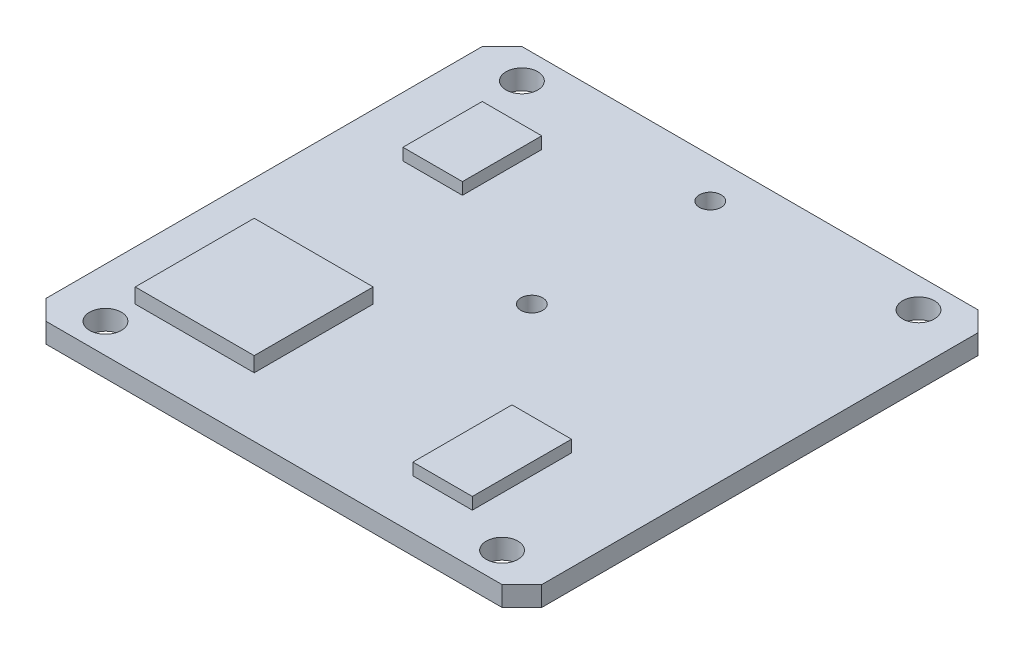
ISO-10303-21;
HEADER;
FILE_DESCRIPTION(('STEP AP214'),'2;1');
FILE_NAME('part.step','',(''),(''),'','','');
FILE_SCHEMA(('AUTOMOTIVE_DESIGN { 1 0 10303 214 1 1 1 1 }'));
ENDSEC;
DATA;
#1=APPLICATION_CONTEXT('core data for automotive mechanical design processes');
#2=APPLICATION_PROTOCOL_DEFINITION('international standard','automotive_design',2000,#1);
#3=PRODUCT_CONTEXT('',#1,'mechanical');
#4=PRODUCT('Part','Part','',(#3));
#5=PRODUCT_RELATED_PRODUCT_CATEGORY('part','',(#4));
#6=PRODUCT_DEFINITION_FORMATION('','',#4);
#7=PRODUCT_DEFINITION_CONTEXT('part definition',#1,'design');
#8=PRODUCT_DEFINITION('design','',#6,#7);
#9=PRODUCT_DEFINITION_SHAPE('','',#8);
#10=(LENGTH_UNIT() NAMED_UNIT(*) SI_UNIT(.MILLI.,.METRE.));
#11=(NAMED_UNIT(*) PLANE_ANGLE_UNIT() SI_UNIT($,.RADIAN.));
#12=(NAMED_UNIT(*) SI_UNIT($,.STERADIAN.) SOLID_ANGLE_UNIT());
#13=UNCERTAINTY_MEASURE_WITH_UNIT(LENGTH_MEASURE(1.E-05),#10,'distance_accuracy_value','');
#14=(GEOMETRIC_REPRESENTATION_CONTEXT(3) GLOBAL_UNCERTAINTY_ASSIGNED_CONTEXT((#13)) GLOBAL_UNIT_ASSIGNED_CONTEXT((#10,
#11,#12)) REPRESENTATION_CONTEXT('',''));
#15=CARTESIAN_POINT('',(0.,0.,0.));
#16=DIRECTION('',(0.,0.,1.));
#17=DIRECTION('',(1.,0.,0.));
#18=AXIS2_PLACEMENT_3D('',#15,#16,#17);
#19=CARTESIAN_POINT('',(0.,1.,0.));
#20=DIRECTION('',(0.,1.,0.));
#21=DIRECTION('',(0.,0.,1.));
#22=AXIS2_PLACEMENT_3D('',#19,#20,#21);
#23=PLANE('',#22);
#24=CARTESIAN_POINT('',(20.,1.,-21.));
#25=DIRECTION('',(0.,1.,0.));
#26=DIRECTION('',(0.,0.,-1.));
#27=AXIS2_PLACEMENT_3D('',#24,#25,#26);
#28=CIRCLE('',#27,1.6);
#29=CARTESIAN_POINT('',(20.,1.,-22.6));
#30=VERTEX_POINT('',#29);
#31=EDGE_CURVE('E271',#30,#30,#28,.T.);
#32=ORIENTED_EDGE('',*,*,#31,.F.);
#33=EDGE_LOOP('',(#32));
#34=FACE_BOUND('',#33,.T.);
#35=CARTESIAN_POINT('',(20.,1.,21.));
#36=DIRECTION('',(0.,1.,0.));
#37=DIRECTION('',(0.,0.,1.));
#38=AXIS2_PLACEMENT_3D('',#35,#36,#37);
#39=CIRCLE('',#38,1.6);
#40=CARTESIAN_POINT('',(20.,1.,22.6));
#41=VERTEX_POINT('',#40);
#42=EDGE_CURVE('E277',#41,#41,#39,.T.);
#43=ORIENTED_EDGE('',*,*,#42,.F.);
#44=EDGE_LOOP('',(#43));
#45=FACE_BOUND('',#44,.T.);
#46=CARTESIAN_POINT('',(-20.,1.,21.));
#47=DIRECTION('',(0.,1.,0.));
#48=DIRECTION('',(0.,0.,-1.));
#49=AXIS2_PLACEMENT_3D('',#46,#47,#48);
#50=CIRCLE('',#49,1.6);
#51=CARTESIAN_POINT('',(-20.,1.,19.4));
#52=VERTEX_POINT('',#51);
#53=EDGE_CURVE('E283',#52,#52,#50,.T.);
#54=ORIENTED_EDGE('',*,*,#53,.F.);
#55=EDGE_LOOP('',(#54));
#56=FACE_BOUND('',#55,.T.);
#57=CARTESIAN_POINT('',(0.,1.,-20.));
#58=DIRECTION('',(0.,1.,0.));
#59=DIRECTION('',(0.,0.,1.));
#60=AXIS2_PLACEMENT_3D('',#57,#58,#59);
#61=CIRCLE('',#60,1.1);
#62=CARTESIAN_POINT('',(0.,1.,-18.9));
#63=VERTEX_POINT('',#62);
#64=EDGE_CURVE('E264',#63,#63,#61,.T.);
#65=ORIENTED_EDGE('',*,*,#64,.F.);
#66=EDGE_LOOP('',(#65));
#67=FACE_BOUND('',#66,.T.);
#68=CARTESIAN_POINT('',(0.,1.,-2.));
#69=DIRECTION('',(0.,1.,0.));
#70=DIRECTION('',(0.,0.,1.));
#71=AXIS2_PLACEMENT_3D('',#68,#69,#70);
#72=CIRCLE('',#71,1.1);
#73=CARTESIAN_POINT('',(0.,1.,-0.899999999999998));
#74=VERTEX_POINT('',#73);
#75=EDGE_CURVE('E260',#74,#74,#72,.T.);
#76=ORIENTED_EDGE('',*,*,#75,.F.);
#77=EDGE_LOOP('',(#76));
#78=FACE_BOUND('',#77,.T.);
#79=CARTESIAN_POINT('',(-20.,1.,-21.));
#80=DIRECTION('',(0.,1.,0.));
#81=DIRECTION('',(0.,0.,1.));
#82=AXIS2_PLACEMENT_3D('',#79,#80,#81);
#83=CIRCLE('',#82,1.6);
#84=CARTESIAN_POINT('',(-20.,1.,-19.4));
#85=VERTEX_POINT('',#84);
#86=EDGE_CURVE('E270',#85,#85,#83,.T.);
#87=ORIENTED_EDGE('',*,*,#86,.F.);
#88=EDGE_LOOP('',(#87));
#89=FACE_BOUND('',#88,.T.);
#90=DIRECTION('',(-1.,0.,0.));
#91=VECTOR('',#90,1.);
#92=CARTESIAN_POINT('',(-25.,1.,-24.));
#93=LINE('',#92,#91);
#94=CARTESIAN_POINT('',(23.,1.,-24.));
#95=VERTEX_POINT('',#94);
#96=CARTESIAN_POINT('',(-23.,1.,-24.));
#97=VERTEX_POINT('',#96);
#98=EDGE_CURVE('E307',#95,#97,#93,.T.);
#99=ORIENTED_EDGE('',*,*,#98,.T.);
#100=DIRECTION('',(0.707106781186548,0.,-0.707106781186548));
#101=VECTOR('',#100,1.);
#102=CARTESIAN_POINT('',(-23.5,1.,-23.5));
#103=LINE('',#102,#101);
#104=CARTESIAN_POINT('',(-25.,1.,-22.));
#105=VERTEX_POINT('',#104);
#106=EDGE_CURVE('E344',#97,#105,#103,.F.);
#107=ORIENTED_EDGE('',*,*,#106,.T.);
#108=DIRECTION('',(0.,0.,1.));
#109=VECTOR('',#108,1.);
#110=CARTESIAN_POINT('',(-25.,1.,-24.));
#111=LINE('',#110,#109);
#112=CARTESIAN_POINT('',(-25.,1.,22.));
#113=VERTEX_POINT('',#112);
#114=EDGE_CURVE('E297',#105,#113,#111,.T.);
#115=ORIENTED_EDGE('',*,*,#114,.T.);
#116=DIRECTION('',(-0.707106781186548,0.,-0.707106781186548));
#117=VECTOR('',#116,1.);
#118=CARTESIAN_POINT('',(-23.5,1.,23.5));
#119=LINE('',#118,#117);
#120=CARTESIAN_POINT('',(-23.,1.,24.));
#121=VERTEX_POINT('',#120);
#122=EDGE_CURVE('E342',#113,#121,#119,.F.);
#123=ORIENTED_EDGE('',*,*,#122,.T.);
#124=DIRECTION('',(1.,0.,0.));
#125=VECTOR('',#124,1.);
#126=CARTESIAN_POINT('',(-25.,1.,24.));
#127=LINE('',#126,#125);
#128=CARTESIAN_POINT('',(23.,1.,24.));
#129=VERTEX_POINT('',#128);
#130=EDGE_CURVE('E300',#121,#129,#127,.T.);
#131=ORIENTED_EDGE('',*,*,#130,.T.);
#132=DIRECTION('',(-0.707106781186548,0.,0.707106781186547));
#133=VECTOR('',#132,1.);
#134=CARTESIAN_POINT('',(23.5,1.,23.5));
#135=LINE('',#134,#133);
#136=CARTESIAN_POINT('',(25.,1.,22.));
#137=VERTEX_POINT('',#136);
#138=EDGE_CURVE('E338',#129,#137,#135,.F.);
#139=ORIENTED_EDGE('',*,*,#138,.T.);
#140=DIRECTION('',(0.,0.,-1.));
#141=VECTOR('',#140,1.);
#142=CARTESIAN_POINT('',(25.,1.,-24.));
#143=LINE('',#142,#141);
#144=CARTESIAN_POINT('',(25.,1.,-22.));
#145=VERTEX_POINT('',#144);
#146=EDGE_CURVE('E304',#137,#145,#143,.T.);
#147=ORIENTED_EDGE('',*,*,#146,.T.);
#148=DIRECTION('',(0.707106781186546,0.,0.707106781186549));
#149=VECTOR('',#148,1.);
#150=CARTESIAN_POINT('',(23.5,1.,-23.5));
#151=LINE('',#150,#149);
#152=EDGE_CURVE('E340',#145,#95,#151,.F.);
#153=ORIENTED_EDGE('',*,*,#152,.T.);
#154=EDGE_LOOP('',(#99,#107,#115,#123,#131,#139,#147,#153));
#155=FACE_BOUND('',#154,.T.);
#156=DIRECTION('',(1.,0.,0.));
#157=VECTOR('',#156,1.);
#158=CARTESIAN_POINT('',(-8.,1.,18.));
#159=LINE('',#158,#157);
#160=CARTESIAN_POINT('',(-20.,1.,18.));
#161=VERTEX_POINT('',#160);
#162=CARTESIAN_POINT('',(-8.,1.,18.));
#163=VERTEX_POINT('',#162);
#164=EDGE_CURVE('E245',#161,#163,#159,.T.);
#165=ORIENTED_EDGE('',*,*,#164,.F.);
#166=DIRECTION('',(0.,0.,1.));
#167=VECTOR('',#166,1.);
#168=CARTESIAN_POINT('',(-20.,1.,6.));
#169=LINE('',#168,#167);
#170=CARTESIAN_POINT('',(-20.,1.,6.));
#171=VERTEX_POINT('',#170);
#172=EDGE_CURVE('E231',#171,#161,#169,.T.);
#173=ORIENTED_EDGE('',*,*,#172,.F.);
#174=DIRECTION('',(-1.,0.,0.));
#175=VECTOR('',#174,1.);
#176=CARTESIAN_POINT('',(-8.,1.,6.));
#177=LINE('',#176,#175);
#178=CARTESIAN_POINT('',(-8.,1.,6.));
#179=VERTEX_POINT('',#178);
#180=EDGE_CURVE('E236',#179,#171,#177,.T.);
#181=ORIENTED_EDGE('',*,*,#180,.F.);
#182=DIRECTION('',(0.,0.,-1.));
#183=VECTOR('',#182,1.);
#184=CARTESIAN_POINT('',(-8.,1.,6.));
#185=LINE('',#184,#183);
#186=EDGE_CURVE('E247',#163,#179,#185,.T.);
#187=ORIENTED_EDGE('',*,*,#186,.F.);
#188=EDGE_LOOP('',(#165,#173,#181,#187));
#189=FACE_BOUND('',#188,.T.);
#190=DIRECTION('',(-1.,0.,0.));
#191=VECTOR('',#190,1.);
#192=CARTESIAN_POINT('',(-13.,1.,-16.));
#193=LINE('',#192,#191);
#194=CARTESIAN_POINT('',(-13.,1.,-16.));
#195=VERTEX_POINT('',#194);
#196=CARTESIAN_POINT('',(-19.,1.,-16.));
#197=VERTEX_POINT('',#196);
#198=EDGE_CURVE('E203',#195,#197,#193,.T.);
#199=ORIENTED_EDGE('',*,*,#198,.F.);
#200=DIRECTION('',(0.,0.,-1.));
#201=VECTOR('',#200,1.);
#202=CARTESIAN_POINT('',(-13.,1.,-16.));
#203=LINE('',#202,#201);
#204=CARTESIAN_POINT('',(-13.,1.,-8.));
#205=VERTEX_POINT('',#204);
#206=EDGE_CURVE('E200',#205,#195,#203,.T.);
#207=ORIENTED_EDGE('',*,*,#206,.F.);
#208=DIRECTION('',(1.,0.,0.));
#209=VECTOR('',#208,1.);
#210=CARTESIAN_POINT('',(-13.,1.,-8.));
#211=LINE('',#210,#209);
#212=CARTESIAN_POINT('',(-19.,1.,-8.));
#213=VERTEX_POINT('',#212);
#214=EDGE_CURVE('E212',#213,#205,#211,.T.);
#215=ORIENTED_EDGE('',*,*,#214,.F.);
#216=DIRECTION('',(0.,0.,1.));
#217=VECTOR('',#216,1.);
#218=CARTESIAN_POINT('',(-19.,1.,-16.));
#219=LINE('',#218,#217);
#220=EDGE_CURVE('E220',#197,#213,#219,.T.);
#221=ORIENTED_EDGE('',*,*,#220,.F.);
#222=EDGE_LOOP('',(#199,#207,#215,#221));
#223=FACE_BOUND('',#222,.T.);
#224=DIRECTION('',(-1.,0.,0.));
#225=VECTOR('',#224,1.);
#226=CARTESIAN_POINT('',(15.,1.,9.));
#227=LINE('',#226,#225);
#228=CARTESIAN_POINT('',(15.,1.,9.));
#229=VERTEX_POINT('',#228);
#230=CARTESIAN_POINT('',(9.,1.,9.));
#231=VERTEX_POINT('',#230);
#232=EDGE_CURVE('E664',#229,#231,#227,.T.);
#233=ORIENTED_EDGE('',*,*,#232,.F.);
#234=DIRECTION('',(0.,0.,-1.));
#235=VECTOR('',#234,1.);
#236=CARTESIAN_POINT('',(15.,1.,9.));
#237=LINE('',#236,#235);
#238=CARTESIAN_POINT('',(15.,1.,19.));
#239=VERTEX_POINT('',#238);
#240=EDGE_CURVE('E198',#239,#229,#237,.T.);
#241=ORIENTED_EDGE('',*,*,#240,.F.);
#242=DIRECTION('',(1.,0.,0.));
#243=VECTOR('',#242,1.);
#244=CARTESIAN_POINT('',(15.,1.,19.));
#245=LINE('',#244,#243);
#246=CARTESIAN_POINT('',(9.,1.,19.));
#247=VERTEX_POINT('',#246);
#248=EDGE_CURVE('E194',#247,#239,#245,.T.);
#249=ORIENTED_EDGE('',*,*,#248,.F.);
#250=DIRECTION('',(0.,0.,1.));
#251=VECTOR('',#250,1.);
#252=CARTESIAN_POINT('',(9.,1.,9.));
#253=LINE('',#252,#251);
#254=EDGE_CURVE('E661',#231,#247,#253,.T.);
#255=ORIENTED_EDGE('',*,*,#254,.F.);
#256=EDGE_LOOP('',(#233,#241,#249,#255));
#257=FACE_BOUND('',#256,.T.);
#258=ADVANCED_FACE('F37',(#34,#45,#56,#67,#78,#89,#155,#189,#223,#257),#23,.T.);
#259=CARTESIAN_POINT('',(-25.,1.,-24.));
#260=DIRECTION('',(1.,0.,0.));
#261=DIRECTION('',(0.,0.,-1.));
#262=AXIS2_PLACEMENT_3D('',#259,#260,#261);
#263=PLANE('',#262);
#264=ORIENTED_EDGE('',*,*,#114,.F.);
#265=DIRECTION('',(0.,-1.,0.));
#266=VECTOR('',#265,1.);
#267=CARTESIAN_POINT('',(-25.,1.,-22.));
#268=LINE('',#267,#266);
#269=CARTESIAN_POINT('',(-25.,-1.,-22.));
#270=VERTEX_POINT('',#269);
#271=EDGE_CURVE('E322',#105,#270,#268,.T.);
#272=ORIENTED_EDGE('',*,*,#271,.T.);
#273=DIRECTION('',(0.,0.,1.));
#274=VECTOR('',#273,1.);
#275=CARTESIAN_POINT('',(-25.,-1.,-24.));
#276=LINE('',#275,#274);
#277=CARTESIAN_POINT('',(-25.,-1.,22.));
#278=VERTEX_POINT('',#277);
#279=EDGE_CURVE('E294',#270,#278,#276,.T.);
#280=ORIENTED_EDGE('',*,*,#279,.T.);
#281=DIRECTION('',(0.,1.,0.));
#282=VECTOR('',#281,1.);
#283=CARTESIAN_POINT('',(-25.,1.,22.));
#284=LINE('',#283,#282);
#285=EDGE_CURVE('E310',#278,#113,#284,.T.);
#286=ORIENTED_EDGE('',*,*,#285,.T.);
#287=EDGE_LOOP('',(#264,#272,#280,#286));
#288=FACE_BOUND('',#287,.T.);
#289=ADVANCED_FACE('F380',(#288),#263,.F.);
#290=CARTESIAN_POINT('',(-25.,1.,24.));
#291=DIRECTION('',(0.,0.,-1.));
#292=DIRECTION('',(-1.,0.,0.));
#293=AXIS2_PLACEMENT_3D('',#290,#291,#292);
#294=PLANE('',#293);
#295=ORIENTED_EDGE('',*,*,#130,.F.);
#296=DIRECTION('',(0.,-1.,0.));
#297=VECTOR('',#296,1.);
#298=CARTESIAN_POINT('',(-23.,1.,24.));
#299=LINE('',#298,#297);
#300=CARTESIAN_POINT('',(-23.,-1.,24.));
#301=VERTEX_POINT('',#300);
#302=EDGE_CURVE('E348',#121,#301,#299,.T.);
#303=ORIENTED_EDGE('',*,*,#302,.T.);
#304=DIRECTION('',(1.,0.,0.));
#305=VECTOR('',#304,1.);
#306=CARTESIAN_POINT('',(-25.,-1.,24.));
#307=LINE('',#306,#305);
#308=CARTESIAN_POINT('',(23.,-1.,24.));
#309=VERTEX_POINT('',#308);
#310=EDGE_CURVE('E313',#301,#309,#307,.T.);
#311=ORIENTED_EDGE('',*,*,#310,.T.);
#312=DIRECTION('',(0.,1.,0.));
#313=VECTOR('',#312,1.);
#314=CARTESIAN_POINT('',(23.,1.,24.));
#315=LINE('',#314,#313);
#316=EDGE_CURVE('E346',#309,#129,#315,.T.);
#317=ORIENTED_EDGE('',*,*,#316,.T.);
#318=EDGE_LOOP('',(#295,#303,#311,#317));
#319=FACE_BOUND('',#318,.T.);
#320=ADVANCED_FACE('F388',(#319),#294,.F.);
#321=CARTESIAN_POINT('',(25.,1.,-24.));
#322=DIRECTION('',(-1.,0.,0.));
#323=DIRECTION('',(0.,0.,1.));
#324=AXIS2_PLACEMENT_3D('',#321,#322,#323);
#325=PLANE('',#324);
#326=DIRECTION('',(0.,0.,-1.));
#327=VECTOR('',#326,1.);
#328=CARTESIAN_POINT('',(25.,-1.,-24.));
#329=LINE('',#328,#327);
#330=CARTESIAN_POINT('',(25.,-1.,22.));
#331=VERTEX_POINT('',#330);
#332=CARTESIAN_POINT('',(25.,-1.,-22.));
#333=VERTEX_POINT('',#332);
#334=EDGE_CURVE('E316',#331,#333,#329,.T.);
#335=ORIENTED_EDGE('',*,*,#334,.T.);
#336=DIRECTION('',(0.,1.,0.));
#337=VECTOR('',#336,1.);
#338=CARTESIAN_POINT('',(25.,1.,-22.));
#339=LINE('',#338,#337);
#340=EDGE_CURVE('E11',#333,#145,#339,.T.);
#341=ORIENTED_EDGE('',*,*,#340,.T.);
#342=ORIENTED_EDGE('',*,*,#146,.F.);
#343=DIRECTION('',(0.,-1.,0.));
#344=VECTOR('',#343,1.);
#345=CARTESIAN_POINT('',(25.,1.,22.));
#346=LINE('',#345,#344);
#347=EDGE_CURVE('E46',#137,#331,#346,.T.);
#348=ORIENTED_EDGE('',*,*,#347,.T.);
#349=EDGE_LOOP('',(#335,#341,#342,#348));
#350=FACE_BOUND('',#349,.T.);
#351=ADVANCED_FACE('F355',(#350),#325,.F.);
#352=CARTESIAN_POINT('',(-25.,1.,-24.));
#353=DIRECTION('',(0.,0.,1.));
#354=DIRECTION('',(1.,0.,0.));
#355=AXIS2_PLACEMENT_3D('',#352,#353,#354);
#356=PLANE('',#355);
#357=DIRECTION('',(-1.,0.,0.));
#358=VECTOR('',#357,1.);
#359=CARTESIAN_POINT('',(-25.,-1.,-24.));
#360=LINE('',#359,#358);
#361=CARTESIAN_POINT('',(23.,-1.,-24.));
#362=VERTEX_POINT('',#361);
#363=CARTESIAN_POINT('',(-23.,-1.,-24.));
#364=VERTEX_POINT('',#363);
#365=EDGE_CURVE('E301',#362,#364,#360,.T.);
#366=ORIENTED_EDGE('',*,*,#365,.T.);
#367=DIRECTION('',(0.,1.,0.));
#368=VECTOR('',#367,1.);
#369=CARTESIAN_POINT('',(-23.,1.,-24.));
#370=LINE('',#369,#368);
#371=EDGE_CURVE('E336',#364,#97,#370,.T.);
#372=ORIENTED_EDGE('',*,*,#371,.T.);
#373=ORIENTED_EDGE('',*,*,#98,.F.);
#374=DIRECTION('',(0.,-1.,0.));
#375=VECTOR('',#374,1.);
#376=CARTESIAN_POINT('',(23.,1.,-24.));
#377=LINE('',#376,#375);
#378=EDGE_CURVE('E333',#95,#362,#377,.T.);
#379=ORIENTED_EDGE('',*,*,#378,.T.);
#380=EDGE_LOOP('',(#366,#372,#373,#379));
#381=FACE_BOUND('',#380,.T.);
#382=ADVANCED_FACE('F370',(#381),#356,.F.);
#383=CARTESIAN_POINT('',(0.,-1.,0.));
#384=DIRECTION('',(0.,1.,0.));
#385=DIRECTION('',(0.,0.,1.));
#386=AXIS2_PLACEMENT_3D('',#383,#384,#385);
#387=PLANE('',#386);
#388=CARTESIAN_POINT('',(20.,-1.,-21.));
#389=DIRECTION('',(0.,1.,0.));
#390=DIRECTION('',(0.,0.,-1.));
#391=AXIS2_PLACEMENT_3D('',#388,#389,#390);
#392=CIRCLE('',#391,1.6);
#393=CARTESIAN_POINT('',(20.,-1.,-22.6));
#394=VERTEX_POINT('',#393);
#395=EDGE_CURVE('E267',#394,#394,#392,.T.);
#396=ORIENTED_EDGE('',*,*,#395,.T.);
#397=EDGE_LOOP('',(#396));
#398=FACE_BOUND('',#397,.T.);
#399=CARTESIAN_POINT('',(20.,-1.,21.));
#400=DIRECTION('',(0.,1.,0.));
#401=DIRECTION('',(0.,0.,1.));
#402=AXIS2_PLACEMENT_3D('',#399,#400,#401);
#403=CIRCLE('',#402,1.6);
#404=CARTESIAN_POINT('',(20.,-1.,22.6));
#405=VERTEX_POINT('',#404);
#406=EDGE_CURVE('E274',#405,#405,#403,.T.);
#407=ORIENTED_EDGE('',*,*,#406,.T.);
#408=EDGE_LOOP('',(#407));
#409=FACE_BOUND('',#408,.T.);
#410=CARTESIAN_POINT('',(-20.,-1.,21.));
#411=DIRECTION('',(0.,1.,0.));
#412=DIRECTION('',(0.,0.,-1.));
#413=AXIS2_PLACEMENT_3D('',#410,#411,#412);
#414=CIRCLE('',#413,1.6);
#415=CARTESIAN_POINT('',(-20.,-1.,19.4));
#416=VERTEX_POINT('',#415);
#417=EDGE_CURVE('E280',#416,#416,#414,.T.);
#418=ORIENTED_EDGE('',*,*,#417,.T.);
#419=EDGE_LOOP('',(#418));
#420=FACE_BOUND('',#419,.T.);
#421=CARTESIAN_POINT('',(0.,-1.,-20.));
#422=DIRECTION('',(0.,1.,0.));
#423=DIRECTION('',(0.,0.,1.));
#424=AXIS2_PLACEMENT_3D('',#421,#422,#423);
#425=CIRCLE('',#424,1.1);
#426=CARTESIAN_POINT('',(0.,-1.,-18.9));
#427=VERTEX_POINT('',#426);
#428=EDGE_CURVE('E286',#427,#427,#425,.T.);
#429=ORIENTED_EDGE('',*,*,#428,.T.);
#430=EDGE_LOOP('',(#429));
#431=FACE_BOUND('',#430,.T.);
#432=CARTESIAN_POINT('',(0.,-1.,-2.));
#433=DIRECTION('',(0.,1.,0.));
#434=DIRECTION('',(0.,0.,1.));
#435=AXIS2_PLACEMENT_3D('',#432,#433,#434);
#436=CIRCLE('',#435,1.1);
#437=CARTESIAN_POINT('',(0.,-1.,-0.899999999999998));
#438=VERTEX_POINT('',#437);
#439=EDGE_CURVE('E261',#438,#438,#436,.T.);
#440=ORIENTED_EDGE('',*,*,#439,.T.);
#441=EDGE_LOOP('',(#440));
#442=FACE_BOUND('',#441,.T.);
#443=CARTESIAN_POINT('',(-20.,-1.,-21.));
#444=DIRECTION('',(0.,1.,0.));
#445=DIRECTION('',(0.,0.,1.));
#446=AXIS2_PLACEMENT_3D('',#443,#444,#445);
#447=CIRCLE('',#446,1.6);
#448=CARTESIAN_POINT('',(-20.,-1.,-19.4));
#449=VERTEX_POINT('',#448);
#450=EDGE_CURVE('E291',#449,#449,#447,.T.);
#451=ORIENTED_EDGE('',*,*,#450,.T.);
#452=EDGE_LOOP('',(#451));
#453=FACE_BOUND('',#452,.T.);
#454=ORIENTED_EDGE('',*,*,#279,.F.);
#455=DIRECTION('',(-0.707106781186548,0.,0.707106781186548));
#456=VECTOR('',#455,1.);
#457=CARTESIAN_POINT('',(-25.,-1.,-22.));
#458=LINE('',#457,#456);
#459=EDGE_CURVE('E331',#270,#364,#458,.F.);
#460=ORIENTED_EDGE('',*,*,#459,.T.);
#461=ORIENTED_EDGE('',*,*,#365,.F.);
#462=DIRECTION('',(-0.707106781186546,0.,-0.707106781186549));
#463=VECTOR('',#462,1.);
#464=CARTESIAN_POINT('',(23.,-1.,-24.));
#465=LINE('',#464,#463);
#466=EDGE_CURVE('E327',#362,#333,#465,.F.);
#467=ORIENTED_EDGE('',*,*,#466,.T.);
#468=ORIENTED_EDGE('',*,*,#334,.F.);
#469=DIRECTION('',(0.707106781186548,0.,-0.707106781186547));
#470=VECTOR('',#469,1.);
#471=CARTESIAN_POINT('',(25.,-1.,22.));
#472=LINE('',#471,#470);
#473=EDGE_CURVE('E325',#331,#309,#472,.F.);
#474=ORIENTED_EDGE('',*,*,#473,.T.);
#475=ORIENTED_EDGE('',*,*,#310,.F.);
#476=DIRECTION('',(0.707106781186548,0.,0.707106781186548));
#477=VECTOR('',#476,1.);
#478=CARTESIAN_POINT('',(-23.,-1.,24.));
#479=LINE('',#478,#477);
#480=EDGE_CURVE('E329',#301,#278,#479,.F.);
#481=ORIENTED_EDGE('',*,*,#480,.T.);
#482=EDGE_LOOP('',(#454,#460,#461,#467,#468,#474,#475,#481));
#483=FACE_BOUND('',#482,.T.);
#484=ADVANCED_FACE('F361',(#398,#409,#420,#431,#442,#453,#483),#387,.F.);
#485=CARTESIAN_POINT('',(-25.,1.,-22.));
#486=DIRECTION('',(0.707106781186547,0.,0.707106781186547));
#487=DIRECTION('',(0.,-1.,0.));
#488=AXIS2_PLACEMENT_3D('',#485,#486,#487);
#489=PLANE('',#488);
#490=ORIENTED_EDGE('',*,*,#106,.F.);
#491=ORIENTED_EDGE('',*,*,#371,.F.);
#492=ORIENTED_EDGE('',*,*,#459,.F.);
#493=ORIENTED_EDGE('',*,*,#271,.F.);
#494=EDGE_LOOP('',(#490,#491,#492,#493));
#495=FACE_BOUND('',#494,.T.);
#496=ADVANCED_FACE('F378',(#495),#489,.F.);
#497=CARTESIAN_POINT('',(-23.,1.,24.));
#498=DIRECTION('',(0.707106781186547,0.,-0.707106781186547));
#499=DIRECTION('',(0.,-1.,0.));
#500=AXIS2_PLACEMENT_3D('',#497,#498,#499);
#501=PLANE('',#500);
#502=ORIENTED_EDGE('',*,*,#122,.F.);
#503=ORIENTED_EDGE('',*,*,#285,.F.);
#504=ORIENTED_EDGE('',*,*,#480,.F.);
#505=ORIENTED_EDGE('',*,*,#302,.F.);
#506=EDGE_LOOP('',(#502,#503,#504,#505));
#507=FACE_BOUND('',#506,.T.);
#508=ADVANCED_FACE('F385',(#507),#501,.F.);
#509=CARTESIAN_POINT('',(23.,1.,-24.));
#510=DIRECTION('',(-0.707106781186549,0.,0.707106781186546));
#511=DIRECTION('',(0.,-1.,0.));
#512=AXIS2_PLACEMENT_3D('',#509,#510,#511);
#513=PLANE('',#512);
#514=ORIENTED_EDGE('',*,*,#152,.F.);
#515=ORIENTED_EDGE('',*,*,#340,.F.);
#516=ORIENTED_EDGE('',*,*,#466,.F.);
#517=ORIENTED_EDGE('',*,*,#378,.F.);
#518=EDGE_LOOP('',(#514,#515,#516,#517));
#519=FACE_BOUND('',#518,.T.);
#520=ADVANCED_FACE('F367',(#519),#513,.F.);
#521=CARTESIAN_POINT('',(25.,1.,22.));
#522=DIRECTION('',(-0.707106781186547,0.,-0.707106781186548));
#523=DIRECTION('',(0.,-1.,0.));
#524=AXIS2_PLACEMENT_3D('',#521,#522,#523);
#525=PLANE('',#524);
#526=ORIENTED_EDGE('',*,*,#138,.F.);
#527=ORIENTED_EDGE('',*,*,#316,.F.);
#528=ORIENTED_EDGE('',*,*,#473,.F.);
#529=ORIENTED_EDGE('',*,*,#347,.F.);
#530=EDGE_LOOP('',(#526,#527,#528,#529));
#531=FACE_BOUND('',#530,.T.);
#532=ADVANCED_FACE('F40',(#531),#525,.F.);
#533=CARTESIAN_POINT('',(-20.,-1.,-21.));
#534=DIRECTION('',(0.,1.,0.));
#535=DIRECTION('',(0.,0.,1.));
#536=AXIS2_PLACEMENT_3D('',#533,#534,#535);
#537=CYLINDRICAL_SURFACE('',#536,1.6);
#538=ORIENTED_EDGE('',*,*,#450,.F.);
#539=EDGE_LOOP('',(#538));
#540=FACE_BOUND('',#539,.T.);
#541=ORIENTED_EDGE('',*,*,#86,.T.);
#542=EDGE_LOOP('',(#541));
#543=FACE_BOUND('',#542,.T.);
#544=ADVANCED_FACE('F391',(#540,#543),#537,.F.);
#545=CARTESIAN_POINT('',(0.,-1.,-2.));
#546=DIRECTION('',(0.,1.,0.));
#547=DIRECTION('',(0.,0.,1.));
#548=AXIS2_PLACEMENT_3D('',#545,#546,#547);
#549=CYLINDRICAL_SURFACE('',#548,1.1);
#550=ORIENTED_EDGE('',*,*,#439,.F.);
#551=EDGE_LOOP('',(#550));
#552=FACE_BOUND('',#551,.T.);
#553=ORIENTED_EDGE('',*,*,#75,.T.);
#554=EDGE_LOOP('',(#553));
#555=FACE_BOUND('',#554,.T.);
#556=ADVANCED_FACE('F396',(#552,#555),#549,.F.);
#557=CARTESIAN_POINT('',(0.,-1.,-20.));
#558=DIRECTION('',(0.,1.,0.));
#559=DIRECTION('',(0.,0.,1.));
#560=AXIS2_PLACEMENT_3D('',#557,#558,#559);
#561=CYLINDRICAL_SURFACE('',#560,1.1);
#562=ORIENTED_EDGE('',*,*,#428,.F.);
#563=EDGE_LOOP('',(#562));
#564=FACE_BOUND('',#563,.T.);
#565=ORIENTED_EDGE('',*,*,#64,.T.);
#566=EDGE_LOOP('',(#565));
#567=FACE_BOUND('',#566,.T.);
#568=ADVANCED_FACE('F468',(#564,#567),#561,.F.);
#569=CARTESIAN_POINT('',(-20.,-1.,21.));
#570=DIRECTION('',(0.,1.,0.));
#571=DIRECTION('',(0.,0.,1.));
#572=AXIS2_PLACEMENT_3D('',#569,#570,#571);
#573=CYLINDRICAL_SURFACE('',#572,1.6);
#574=ORIENTED_EDGE('',*,*,#417,.F.);
#575=EDGE_LOOP('',(#574));
#576=FACE_BOUND('',#575,.T.);
#577=ORIENTED_EDGE('',*,*,#53,.T.);
#578=EDGE_LOOP('',(#577));
#579=FACE_BOUND('',#578,.T.);
#580=ADVANCED_FACE('F478',(#576,#579),#573,.F.);
#581=CARTESIAN_POINT('',(20.,-1.,21.));
#582=DIRECTION('',(0.,1.,0.));
#583=DIRECTION('',(0.,0.,1.));
#584=AXIS2_PLACEMENT_3D('',#581,#582,#583);
#585=CYLINDRICAL_SURFACE('',#584,1.6);
#586=ORIENTED_EDGE('',*,*,#406,.F.);
#587=EDGE_LOOP('',(#586));
#588=FACE_BOUND('',#587,.T.);
#589=ORIENTED_EDGE('',*,*,#42,.T.);
#590=EDGE_LOOP('',(#589));
#591=FACE_BOUND('',#590,.T.);
#592=ADVANCED_FACE('F487',(#588,#591),#585,.F.);
#593=CARTESIAN_POINT('',(20.,-1.,-21.));
#594=DIRECTION('',(0.,1.,0.));
#595=DIRECTION('',(0.,0.,1.));
#596=AXIS2_PLACEMENT_3D('',#593,#594,#595);
#597=CYLINDRICAL_SURFACE('',#596,1.6);
#598=ORIENTED_EDGE('',*,*,#395,.F.);
#599=EDGE_LOOP('',(#598));
#600=FACE_BOUND('',#599,.T.);
#601=ORIENTED_EDGE('',*,*,#31,.T.);
#602=EDGE_LOOP('',(#601));
#603=FACE_BOUND('',#602,.T.);
#604=ADVANCED_FACE('F497',(#600,#603),#597,.F.);
#605=CARTESIAN_POINT('',(-20.,2.5,6.));
#606=DIRECTION('',(1.,0.,0.));
#607=DIRECTION('',(0.,0.,-1.));
#608=AXIS2_PLACEMENT_3D('',#605,#606,#607);
#609=PLANE('',#608);
#610=ORIENTED_EDGE('',*,*,#172,.T.);
#611=DIRECTION('',(0.,-1.,0.));
#612=VECTOR('',#611,1.);
#613=CARTESIAN_POINT('',(-20.,2.5,18.));
#614=LINE('',#613,#612);
#615=CARTESIAN_POINT('',(-20.,2.5,18.));
#616=VERTEX_POINT('',#615);
#617=EDGE_CURVE('E258',#616,#161,#614,.T.);
#618=ORIENTED_EDGE('',*,*,#617,.F.);
#619=DIRECTION('',(0.,0.,1.));
#620=VECTOR('',#619,1.);
#621=CARTESIAN_POINT('',(-20.,2.5,6.));
#622=LINE('',#621,#620);
#623=CARTESIAN_POINT('',(-20.,2.5,6.));
#624=VERTEX_POINT('',#623);
#625=EDGE_CURVE('E232',#624,#616,#622,.T.);
#626=ORIENTED_EDGE('',*,*,#625,.F.);
#627=DIRECTION('',(0.,-1.,0.));
#628=VECTOR('',#627,1.);
#629=CARTESIAN_POINT('',(-20.,2.5,6.));
#630=LINE('',#629,#628);
#631=EDGE_CURVE('E242',#624,#171,#630,.T.);
#632=ORIENTED_EDGE('',*,*,#631,.T.);
#633=EDGE_LOOP('',(#610,#618,#626,#632));
#634=FACE_BOUND('',#633,.T.);
#635=ADVANCED_FACE('F507',(#634),#609,.F.);
#636=CARTESIAN_POINT('',(-8.,2.5,18.));
#637=DIRECTION('',(0.,0.,-1.));
#638=DIRECTION('',(-1.,0.,0.));
#639=AXIS2_PLACEMENT_3D('',#636,#637,#638);
#640=PLANE('',#639);
#641=ORIENTED_EDGE('',*,*,#164,.T.);
#642=DIRECTION('',(0.,-1.,0.));
#643=VECTOR('',#642,1.);
#644=CARTESIAN_POINT('',(-8.,2.5,18.));
#645=LINE('',#644,#643);
#646=CARTESIAN_POINT('',(-8.,2.5,18.));
#647=VERTEX_POINT('',#646);
#648=EDGE_CURVE('E255',#647,#163,#645,.T.);
#649=ORIENTED_EDGE('',*,*,#648,.F.);
#650=DIRECTION('',(1.,0.,0.));
#651=VECTOR('',#650,1.);
#652=CARTESIAN_POINT('',(-8.,2.5,18.));
#653=LINE('',#652,#651);
#654=EDGE_CURVE('E235',#616,#647,#653,.T.);
#655=ORIENTED_EDGE('',*,*,#654,.F.);
#656=ORIENTED_EDGE('',*,*,#617,.T.);
#657=EDGE_LOOP('',(#641,#649,#655,#656));
#658=FACE_BOUND('',#657,.T.);
#659=ADVANCED_FACE('F517',(#658),#640,.F.);
#660=CARTESIAN_POINT('',(-8.,2.5,6.));
#661=DIRECTION('',(-1.,0.,0.));
#662=DIRECTION('',(0.,0.,1.));
#663=AXIS2_PLACEMENT_3D('',#660,#661,#662);
#664=PLANE('',#663);
#665=ORIENTED_EDGE('',*,*,#186,.T.);
#666=DIRECTION('',(0.,-1.,0.));
#667=VECTOR('',#666,1.);
#668=CARTESIAN_POINT('',(-8.,2.5,6.));
#669=LINE('',#668,#667);
#670=CARTESIAN_POINT('',(-8.,2.5,6.));
#671=VERTEX_POINT('',#670);
#672=EDGE_CURVE('E253',#671,#179,#669,.T.);
#673=ORIENTED_EDGE('',*,*,#672,.F.);
#674=DIRECTION('',(0.,0.,-1.));
#675=VECTOR('',#674,1.);
#676=CARTESIAN_POINT('',(-8.,2.5,6.));
#677=LINE('',#676,#675);
#678=EDGE_CURVE('E238',#647,#671,#677,.T.);
#679=ORIENTED_EDGE('',*,*,#678,.F.);
#680=ORIENTED_EDGE('',*,*,#648,.T.);
#681=EDGE_LOOP('',(#665,#673,#679,#680));
#682=FACE_BOUND('',#681,.T.);
#683=ADVANCED_FACE('F527',(#682),#664,.F.);
#684=CARTESIAN_POINT('',(-8.,2.5,6.));
#685=DIRECTION('',(0.,0.,1.));
#686=DIRECTION('',(1.,0.,0.));
#687=AXIS2_PLACEMENT_3D('',#684,#685,#686);
#688=PLANE('',#687);
#689=ORIENTED_EDGE('',*,*,#180,.T.);
#690=ORIENTED_EDGE('',*,*,#631,.F.);
#691=DIRECTION('',(-1.,0.,0.));
#692=VECTOR('',#691,1.);
#693=CARTESIAN_POINT('',(-8.,2.5,6.));
#694=LINE('',#693,#692);
#695=EDGE_CURVE('E240',#671,#624,#694,.T.);
#696=ORIENTED_EDGE('',*,*,#695,.F.);
#697=ORIENTED_EDGE('',*,*,#672,.T.);
#698=EDGE_LOOP('',(#689,#690,#696,#697));
#699=FACE_BOUND('',#698,.T.);
#700=ADVANCED_FACE('F537',(#699),#688,.F.);
#701=CARTESIAN_POINT('',(0.,2.5,0.));
#702=DIRECTION('',(0.,-1.,0.));
#703=DIRECTION('',(0.,0.,-1.));
#704=AXIS2_PLACEMENT_3D('',#701,#702,#703);
#705=PLANE('',#704);
#706=ORIENTED_EDGE('',*,*,#625,.T.);
#707=ORIENTED_EDGE('',*,*,#654,.T.);
#708=ORIENTED_EDGE('',*,*,#678,.T.);
#709=ORIENTED_EDGE('',*,*,#695,.T.);
#710=EDGE_LOOP('',(#706,#707,#708,#709));
#711=FACE_BOUND('',#710,.T.);
#712=ADVANCED_FACE('F547',(#711),#705,.F.);
#713=CARTESIAN_POINT('',(-13.,2.2,-16.));
#714=DIRECTION('',(-1.,0.,0.));
#715=DIRECTION('',(0.,0.,1.));
#716=AXIS2_PLACEMENT_3D('',#713,#714,#715);
#717=PLANE('',#716);
#718=ORIENTED_EDGE('',*,*,#206,.T.);
#719=DIRECTION('',(0.,-1.,0.));
#720=VECTOR('',#719,1.);
#721=CARTESIAN_POINT('',(-13.,2.2,-16.));
#722=LINE('',#721,#720);
#723=CARTESIAN_POINT('',(-13.,2.2,-16.));
#724=VERTEX_POINT('',#723);
#725=EDGE_CURVE('E229',#724,#195,#722,.T.);
#726=ORIENTED_EDGE('',*,*,#725,.F.);
#727=DIRECTION('',(0.,0.,-1.));
#728=VECTOR('',#727,1.);
#729=CARTESIAN_POINT('',(-13.,2.2,-16.));
#730=LINE('',#729,#728);
#731=CARTESIAN_POINT('',(-13.,2.2,-8.));
#732=VERTEX_POINT('',#731);
#733=EDGE_CURVE('E208',#732,#724,#730,.T.);
#734=ORIENTED_EDGE('',*,*,#733,.F.);
#735=DIRECTION('',(0.,-1.,0.));
#736=VECTOR('',#735,1.);
#737=CARTESIAN_POINT('',(-13.,2.2,-8.));
#738=LINE('',#737,#736);
#739=EDGE_CURVE('E217',#732,#205,#738,.T.);
#740=ORIENTED_EDGE('',*,*,#739,.T.);
#741=EDGE_LOOP('',(#718,#726,#734,#740));
#742=FACE_BOUND('',#741,.T.);
#743=ADVANCED_FACE('F556',(#742),#717,.F.);
#744=CARTESIAN_POINT('',(-13.,2.2,-16.));
#745=DIRECTION('',(0.,0.,1.));
#746=DIRECTION('',(1.,0.,0.));
#747=AXIS2_PLACEMENT_3D('',#744,#745,#746);
#748=PLANE('',#747);
#749=ORIENTED_EDGE('',*,*,#198,.T.);
#750=DIRECTION('',(0.,-1.,0.));
#751=VECTOR('',#750,1.);
#752=CARTESIAN_POINT('',(-19.,2.2,-16.));
#753=LINE('',#752,#751);
#754=CARTESIAN_POINT('',(-19.,2.2,-16.));
#755=VERTEX_POINT('',#754);
#756=EDGE_CURVE('E226',#755,#197,#753,.T.);
#757=ORIENTED_EDGE('',*,*,#756,.F.);
#758=DIRECTION('',(-1.,0.,0.));
#759=VECTOR('',#758,1.);
#760=CARTESIAN_POINT('',(-13.,2.2,-16.));
#761=LINE('',#760,#759);
#762=EDGE_CURVE('E211',#724,#755,#761,.T.);
#763=ORIENTED_EDGE('',*,*,#762,.F.);
#764=ORIENTED_EDGE('',*,*,#725,.T.);
#765=EDGE_LOOP('',(#749,#757,#763,#764));
#766=FACE_BOUND('',#765,.T.);
#767=ADVANCED_FACE('F571',(#766),#748,.F.);
#768=CARTESIAN_POINT('',(-19.,2.2,-16.));
#769=DIRECTION('',(1.,0.,0.));
#770=DIRECTION('',(0.,0.,-1.));
#771=AXIS2_PLACEMENT_3D('',#768,#769,#770);
#772=PLANE('',#771);
#773=ORIENTED_EDGE('',*,*,#220,.T.);
#774=DIRECTION('',(0.,-1.,0.));
#775=VECTOR('',#774,1.);
#776=CARTESIAN_POINT('',(-19.,2.2,-8.));
#777=LINE('',#776,#775);
#778=CARTESIAN_POINT('',(-19.,2.2,-8.));
#779=VERTEX_POINT('',#778);
#780=EDGE_CURVE('E61',#779,#213,#777,.T.);
#781=ORIENTED_EDGE('',*,*,#780,.F.);
#782=DIRECTION('',(0.,0.,1.));
#783=VECTOR('',#782,1.);
#784=CARTESIAN_POINT('',(-19.,2.2,-16.));
#785=LINE('',#784,#783);
#786=EDGE_CURVE('E214',#755,#779,#785,.T.);
#787=ORIENTED_EDGE('',*,*,#786,.F.);
#788=ORIENTED_EDGE('',*,*,#756,.T.);
#789=EDGE_LOOP('',(#773,#781,#787,#788));
#790=FACE_BOUND('',#789,.T.);
#791=ADVANCED_FACE('F581',(#790),#772,.F.);
#792=CARTESIAN_POINT('',(-13.,2.2,-8.));
#793=DIRECTION('',(0.,0.,-1.));
#794=DIRECTION('',(-1.,0.,0.));
#795=AXIS2_PLACEMENT_3D('',#792,#793,#794);
#796=PLANE('',#795);
#797=ORIENTED_EDGE('',*,*,#214,.T.);
#798=ORIENTED_EDGE('',*,*,#739,.F.);
#799=DIRECTION('',(1.,0.,0.));
#800=VECTOR('',#799,1.);
#801=CARTESIAN_POINT('',(-13.,2.2,-8.));
#802=LINE('',#801,#800);
#803=EDGE_CURVE('E216',#779,#732,#802,.T.);
#804=ORIENTED_EDGE('',*,*,#803,.F.);
#805=ORIENTED_EDGE('',*,*,#780,.T.);
#806=EDGE_LOOP('',(#797,#798,#804,#805));
#807=FACE_BOUND('',#806,.T.);
#808=ADVANCED_FACE('F591',(#807),#796,.F.);
#809=CARTESIAN_POINT('',(0.,2.2,0.));
#810=DIRECTION('',(0.,-1.,0.));
#811=DIRECTION('',(0.,0.,-1.));
#812=AXIS2_PLACEMENT_3D('',#809,#810,#811);
#813=PLANE('',#812);
#814=ORIENTED_EDGE('',*,*,#733,.T.);
#815=ORIENTED_EDGE('',*,*,#762,.T.);
#816=ORIENTED_EDGE('',*,*,#786,.T.);
#817=ORIENTED_EDGE('',*,*,#803,.T.);
#818=EDGE_LOOP('',(#814,#815,#816,#817));
#819=FACE_BOUND('',#818,.T.);
#820=ADVANCED_FACE('F601',(#819),#813,.F.);
#821=CARTESIAN_POINT('',(15.,2.2,9.));
#822=DIRECTION('',(-1.,0.,0.));
#823=DIRECTION('',(0.,0.,1.));
#824=AXIS2_PLACEMENT_3D('',#821,#822,#823);
#825=PLANE('',#824);
#826=ORIENTED_EDGE('',*,*,#240,.T.);
#827=DIRECTION('',(0.,-1.,0.));
#828=VECTOR('',#827,1.);
#829=CARTESIAN_POINT('',(15.,2.2,9.));
#830=LINE('',#829,#828);
#831=CARTESIAN_POINT('',(15.,2.2,9.));
#832=VERTEX_POINT('',#831);
#833=EDGE_CURVE('E179',#832,#229,#830,.T.);
#834=ORIENTED_EDGE('',*,*,#833,.F.);
#835=DIRECTION('',(0.,0.,-1.));
#836=VECTOR('',#835,1.);
#837=CARTESIAN_POINT('',(15.,2.2,9.));
#838=LINE('',#837,#836);
#839=CARTESIAN_POINT('',(15.,2.2,19.));
#840=VERTEX_POINT('',#839);
#841=EDGE_CURVE('E186',#840,#832,#838,.T.);
#842=ORIENTED_EDGE('',*,*,#841,.F.);
#843=DIRECTION('',(0.,-1.,0.));
#844=VECTOR('',#843,1.);
#845=CARTESIAN_POINT('',(15.,2.2,19.));
#846=LINE('',#845,#844);
#847=EDGE_CURVE('E658',#840,#239,#846,.T.);
#848=ORIENTED_EDGE('',*,*,#847,.T.);
#849=EDGE_LOOP('',(#826,#834,#842,#848));
#850=FACE_BOUND('',#849,.T.);
#851=ADVANCED_FACE('F196',(#850),#825,.F.);
#852=CARTESIAN_POINT('',(15.,2.2,9.));
#853=DIRECTION('',(0.,0.,1.));
#854=DIRECTION('',(1.,0.,0.));
#855=AXIS2_PLACEMENT_3D('',#852,#853,#854);
#856=PLANE('',#855);
#857=ORIENTED_EDGE('',*,*,#232,.T.);
#858=DIRECTION('',(0.,-1.,0.));
#859=VECTOR('',#858,1.);
#860=CARTESIAN_POINT('',(9.,2.2,9.));
#861=LINE('',#860,#859);
#862=CARTESIAN_POINT('',(9.,2.2,9.));
#863=VERTEX_POINT('',#862);
#864=EDGE_CURVE('E182',#863,#231,#861,.T.);
#865=ORIENTED_EDGE('',*,*,#864,.F.);
#866=DIRECTION('',(-1.,0.,0.));
#867=VECTOR('',#866,1.);
#868=CARTESIAN_POINT('',(15.,2.2,9.));
#869=LINE('',#868,#867);
#870=EDGE_CURVE('E175',#832,#863,#869,.T.);
#871=ORIENTED_EDGE('',*,*,#870,.F.);
#872=ORIENTED_EDGE('',*,*,#833,.T.);
#873=EDGE_LOOP('',(#857,#865,#871,#872));
#874=FACE_BOUND('',#873,.T.);
#875=ADVANCED_FACE('F177',(#874),#856,.F.);
#876=CARTESIAN_POINT('',(9.,2.2,9.));
#877=DIRECTION('',(1.,0.,0.));
#878=DIRECTION('',(0.,0.,-1.));
#879=AXIS2_PLACEMENT_3D('',#876,#877,#878);
#880=PLANE('',#879);
#881=ORIENTED_EDGE('',*,*,#254,.T.);
#882=DIRECTION('',(0.,-1.,0.));
#883=VECTOR('',#882,1.);
#884=CARTESIAN_POINT('',(9.,2.2,19.));
#885=LINE('',#884,#883);
#886=CARTESIAN_POINT('',(9.,2.2,19.));
#887=VERTEX_POINT('',#886);
#888=EDGE_CURVE('E53',#887,#247,#885,.T.);
#889=ORIENTED_EDGE('',*,*,#888,.F.);
#890=DIRECTION('',(0.,0.,1.));
#891=VECTOR('',#890,1.);
#892=CARTESIAN_POINT('',(9.,2.2,9.));
#893=LINE('',#892,#891);
#894=EDGE_CURVE('E185',#863,#887,#893,.T.);
#895=ORIENTED_EDGE('',*,*,#894,.F.);
#896=ORIENTED_EDGE('',*,*,#864,.T.);
#897=EDGE_LOOP('',(#881,#889,#895,#896));
#898=FACE_BOUND('',#897,.T.);
#899=ADVANCED_FACE('F627',(#898),#880,.F.);
#900=CARTESIAN_POINT('',(15.,2.2,19.));
#901=DIRECTION('',(0.,0.,-1.));
#902=DIRECTION('',(-1.,0.,0.));
#903=AXIS2_PLACEMENT_3D('',#900,#901,#902);
#904=PLANE('',#903);
#905=ORIENTED_EDGE('',*,*,#248,.T.);
#906=ORIENTED_EDGE('',*,*,#847,.F.);
#907=DIRECTION('',(1.,0.,0.));
#908=VECTOR('',#907,1.);
#909=CARTESIAN_POINT('',(15.,2.2,19.));
#910=LINE('',#909,#908);
#911=EDGE_CURVE('E190',#887,#840,#910,.T.);
#912=ORIENTED_EDGE('',*,*,#911,.F.);
#913=ORIENTED_EDGE('',*,*,#888,.T.);
#914=EDGE_LOOP('',(#905,#906,#912,#913));
#915=FACE_BOUND('',#914,.T.);
#916=ADVANCED_FACE('F636',(#915),#904,.F.);
#917=CARTESIAN_POINT('',(0.,2.2,0.));
#918=DIRECTION('',(0.,-1.,0.));
#919=DIRECTION('',(0.,0.,-1.));
#920=AXIS2_PLACEMENT_3D('',#917,#918,#919);
#921=PLANE('',#920);
#922=ORIENTED_EDGE('',*,*,#841,.T.);
#923=ORIENTED_EDGE('',*,*,#870,.T.);
#924=ORIENTED_EDGE('',*,*,#894,.T.);
#925=ORIENTED_EDGE('',*,*,#911,.T.);
#926=EDGE_LOOP('',(#922,#923,#924,#925));
#927=FACE_BOUND('',#926,.T.);
#928=ADVANCED_FACE('F189',(#927),#921,.F.);
#929=CLOSED_SHELL('',(#258,#289,#320,#351,#382,#484,#496,#508,#520,#532,#544,#556,#568,#580,
#592,#604,#635,#659,#683,#700,#712,#743,#767,#791,#808,#820,#851,#875,#899,#916,#928));
#930=MANIFOLD_SOLID_BREP('B2',#929);
#931=ADVANCED_BREP_SHAPE_REPRESENTATION('',(#18,#930),#14);
#932=SHAPE_DEFINITION_REPRESENTATION(#9,#931);
ENDSEC;
END-ISO-10303-21;
